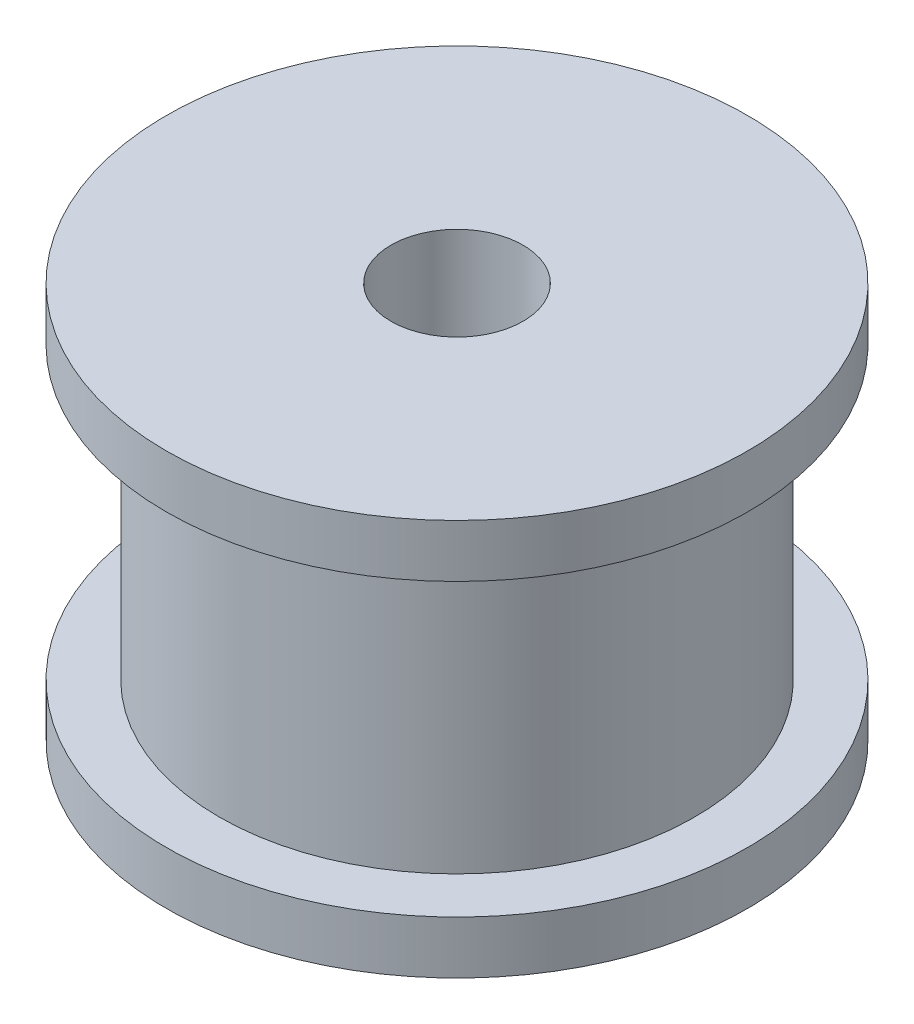
ISO-10303-21;
HEADER;
FILE_DESCRIPTION(('STEP AP214'),'2;1');
FILE_NAME('part.step','',(''),(''),'','','');
FILE_SCHEMA(('AUTOMOTIVE_DESIGN { 1 0 10303 214 1 1 1 1 }'));
ENDSEC;
DATA;
#1=APPLICATION_CONTEXT('core data for automotive mechanical design processes');
#2=APPLICATION_PROTOCOL_DEFINITION('international standard','automotive_design',2000,#1);
#3=PRODUCT_CONTEXT('',#1,'mechanical');
#4=PRODUCT('Part','Part','',(#3));
#5=PRODUCT_RELATED_PRODUCT_CATEGORY('part','',(#4));
#6=PRODUCT_DEFINITION_FORMATION('','',#4);
#7=PRODUCT_DEFINITION_CONTEXT('part definition',#1,'design');
#8=PRODUCT_DEFINITION('design','',#6,#7);
#9=PRODUCT_DEFINITION_SHAPE('','',#8);
#10=(LENGTH_UNIT() NAMED_UNIT(*) SI_UNIT(.MILLI.,.METRE.));
#11=(NAMED_UNIT(*) PLANE_ANGLE_UNIT() SI_UNIT($,.RADIAN.));
#12=(NAMED_UNIT(*) SI_UNIT($,.STERADIAN.) SOLID_ANGLE_UNIT());
#13=UNCERTAINTY_MEASURE_WITH_UNIT(LENGTH_MEASURE(1.E-05),#10,'distance_accuracy_value','');
#14=(GEOMETRIC_REPRESENTATION_CONTEXT(3) GLOBAL_UNCERTAINTY_ASSIGNED_CONTEXT((#13)) GLOBAL_UNIT_ASSIGNED_CONTEXT((#10,
#11,#12)) REPRESENTATION_CONTEXT('',''));
#15=CARTESIAN_POINT('',(0.,0.,0.));
#16=DIRECTION('',(0.,0.,1.));
#17=DIRECTION('',(1.,0.,0.));
#18=AXIS2_PLACEMENT_3D('',#15,#16,#17);
#19=CARTESIAN_POINT('',(0.,-11.,0.));
#20=DIRECTION('',(0.,1.,0.));
#21=DIRECTION('',(0.,0.,1.));
#22=AXIS2_PLACEMENT_3D('',#19,#20,#21);
#23=CYLINDRICAL_SURFACE('',#22,9.);
#24=CARTESIAN_POINT('',(0.,-11.,0.));
#25=DIRECTION('',(0.,1.,0.));
#26=DIRECTION('',(0.,0.,1.));
#27=AXIS2_PLACEMENT_3D('',#24,#25,#26);
#28=CIRCLE('',#27,9.);
#29=CARTESIAN_POINT('',(0.,-11.,9.));
#30=VERTEX_POINT('',#29);
#31=EDGE_CURVE('E52',#30,#30,#28,.T.);
#32=ORIENTED_EDGE('',*,*,#31,.T.);
#33=EDGE_LOOP('',(#32));
#34=FACE_BOUND('',#33,.T.);
#35=CARTESIAN_POINT('',(0.,0.,0.));
#36=DIRECTION('',(0.,1.,0.));
#37=DIRECTION('',(0.,0.,1.));
#38=AXIS2_PLACEMENT_3D('',#35,#36,#37);
#39=CIRCLE('',#38,9.);
#40=CARTESIAN_POINT('',(0.,0.,9.));
#41=VERTEX_POINT('',#40);
#42=EDGE_CURVE('E10',#41,#41,#39,.T.);
#43=ORIENTED_EDGE('',*,*,#42,.F.);
#44=EDGE_LOOP('',(#43));
#45=FACE_BOUND('',#44,.T.);
#46=ADVANCED_FACE('F38',(#34,#45),#23,.T.);
#47=CARTESIAN_POINT('',(0.,2.,0.));
#48=DIRECTION('',(0.,-1.,0.));
#49=DIRECTION('',(0.,0.,-1.));
#50=AXIS2_PLACEMENT_3D('',#47,#48,#49);
#51=CYLINDRICAL_SURFACE('',#50,11.);
#52=CARTESIAN_POINT('',(0.,2.,0.));
#53=DIRECTION('',(0.,1.,0.));
#54=DIRECTION('',(0.,0.,1.));
#55=AXIS2_PLACEMENT_3D('',#52,#53,#54);
#56=CIRCLE('',#55,11.);
#57=CARTESIAN_POINT('',(0.,2.,11.));
#58=VERTEX_POINT('',#57);
#59=EDGE_CURVE('E45',#58,#58,#56,.T.);
#60=ORIENTED_EDGE('',*,*,#59,.F.);
#61=EDGE_LOOP('',(#60));
#62=FACE_BOUND('',#61,.T.);
#63=CARTESIAN_POINT('',(0.,0.,0.));
#64=DIRECTION('',(0.,1.,0.));
#65=DIRECTION('',(0.,0.,1.));
#66=AXIS2_PLACEMENT_3D('',#63,#64,#65);
#67=CIRCLE('',#66,11.);
#68=CARTESIAN_POINT('',(0.,0.,11.));
#69=VERTEX_POINT('',#68);
#70=EDGE_CURVE('E49',#69,#69,#67,.T.);
#71=ORIENTED_EDGE('',*,*,#70,.T.);
#72=EDGE_LOOP('',(#71));
#73=FACE_BOUND('',#72,.T.);
#74=ADVANCED_FACE('F96',(#62,#73),#51,.T.);
#75=CARTESIAN_POINT('',(0.,2.,0.));
#76=DIRECTION('',(0.,1.,0.));
#77=DIRECTION('',(0.,0.,1.));
#78=AXIS2_PLACEMENT_3D('',#75,#76,#77);
#79=PLANE('',#78);
#80=CARTESIAN_POINT('',(0.,2.,0.));
#81=DIRECTION('',(0.,1.,0.));
#82=DIRECTION('',(0.,0.,1.));
#83=AXIS2_PLACEMENT_3D('',#80,#81,#82);
#84=CIRCLE('',#83,2.5);
#85=CARTESIAN_POINT('',(0.,2.,2.5));
#86=VERTEX_POINT('',#85);
#87=EDGE_CURVE('E63',#86,#86,#84,.T.);
#88=ORIENTED_EDGE('',*,*,#87,.F.);
#89=EDGE_LOOP('',(#88));
#90=FACE_BOUND('',#89,.T.);
#91=ORIENTED_EDGE('',*,*,#59,.T.);
#92=EDGE_LOOP('',(#91));
#93=FACE_BOUND('',#92,.T.);
#94=ADVANCED_FACE('F101',(#90,#93),#79,.T.);
#95=CARTESIAN_POINT('',(0.,0.,0.));
#96=DIRECTION('',(0.,1.,0.));
#97=DIRECTION('',(0.,0.,1.));
#98=AXIS2_PLACEMENT_3D('',#95,#96,#97);
#99=PLANE('',#98);
#100=ORIENTED_EDGE('',*,*,#42,.T.);
#101=EDGE_LOOP('',(#100));
#102=FACE_BOUND('',#101,.T.);
#103=ORIENTED_EDGE('',*,*,#70,.F.);
#104=EDGE_LOOP('',(#103));
#105=FACE_BOUND('',#104,.T.);
#106=ADVANCED_FACE('F82',(#102,#105),#99,.F.);
#107=CARTESIAN_POINT('',(0.,-13.,0.));
#108=DIRECTION('',(0.,1.,0.));
#109=DIRECTION('',(0.,0.,1.));
#110=AXIS2_PLACEMENT_3D('',#107,#108,#109);
#111=CYLINDRICAL_SURFACE('',#110,11.);
#112=CARTESIAN_POINT('',(0.,-13.,0.));
#113=DIRECTION('',(0.,-1.,0.));
#114=DIRECTION('',(0.,0.,-1.));
#115=AXIS2_PLACEMENT_3D('',#112,#113,#114);
#116=CIRCLE('',#115,11.);
#117=CARTESIAN_POINT('',(0.,-13.,-11.));
#118=VERTEX_POINT('',#117);
#119=EDGE_CURVE('E55',#118,#118,#116,.T.);
#120=ORIENTED_EDGE('',*,*,#119,.F.);
#121=EDGE_LOOP('',(#120));
#122=FACE_BOUND('',#121,.T.);
#123=CARTESIAN_POINT('',(0.,-11.,0.));
#124=DIRECTION('',(0.,-1.,0.));
#125=DIRECTION('',(0.,0.,-1.));
#126=AXIS2_PLACEMENT_3D('',#123,#124,#125);
#127=CIRCLE('',#126,11.);
#128=CARTESIAN_POINT('',(0.,-11.,-11.));
#129=VERTEX_POINT('',#128);
#130=EDGE_CURVE('E58',#129,#129,#127,.T.);
#131=ORIENTED_EDGE('',*,*,#130,.T.);
#132=EDGE_LOOP('',(#131));
#133=FACE_BOUND('',#132,.T.);
#134=ADVANCED_FACE('F76',(#122,#133),#111,.T.);
#135=CARTESIAN_POINT('',(0.,-13.,0.));
#136=DIRECTION('',(0.,-1.,0.));
#137=DIRECTION('',(0.,0.,-1.));
#138=AXIS2_PLACEMENT_3D('',#135,#136,#137);
#139=PLANE('',#138);
#140=CARTESIAN_POINT('',(0.,-13.,0.));
#141=DIRECTION('',(0.,-1.,0.));
#142=DIRECTION('',(0.,0.,-1.));
#143=AXIS2_PLACEMENT_3D('',#140,#141,#142);
#144=CIRCLE('',#143,2.5);
#145=CARTESIAN_POINT('',(0.,-13.,-2.5));
#146=VERTEX_POINT('',#145);
#147=EDGE_CURVE('E41',#146,#146,#144,.T.);
#148=ORIENTED_EDGE('',*,*,#147,.F.);
#149=EDGE_LOOP('',(#148));
#150=FACE_BOUND('',#149,.T.);
#151=ORIENTED_EDGE('',*,*,#119,.T.);
#152=EDGE_LOOP('',(#151));
#153=FACE_BOUND('',#152,.T.);
#154=ADVANCED_FACE('F72',(#150,#153),#139,.T.);
#155=CARTESIAN_POINT('',(0.,-11.,0.));
#156=DIRECTION('',(0.,-1.,0.));
#157=DIRECTION('',(0.,0.,-1.));
#158=AXIS2_PLACEMENT_3D('',#155,#156,#157);
#159=PLANE('',#158);
#160=ORIENTED_EDGE('',*,*,#31,.F.);
#161=EDGE_LOOP('',(#160));
#162=FACE_BOUND('',#161,.T.);
#163=ORIENTED_EDGE('',*,*,#130,.F.);
#164=EDGE_LOOP('',(#163));
#165=FACE_BOUND('',#164,.T.);
#166=ADVANCED_FACE('F75',(#162,#165),#159,.F.);
#167=CARTESIAN_POINT('',(0.,-20.,0.));
#168=DIRECTION('',(0.,1.,0.));
#169=DIRECTION('',(0.,0.,1.));
#170=AXIS2_PLACEMENT_3D('',#167,#168,#169);
#171=CYLINDRICAL_SURFACE('',#170,2.5);
#172=ORIENTED_EDGE('',*,*,#147,.T.);
#173=EDGE_LOOP('',(#172));
#174=FACE_BOUND('',#173,.T.);
#175=ORIENTED_EDGE('',*,*,#87,.T.);
#176=EDGE_LOOP('',(#175));
#177=FACE_BOUND('',#176,.T.);
#178=ADVANCED_FACE('F70',(#174,#177),#171,.F.);
#179=CLOSED_SHELL('',(#46,#74,#94,#106,#134,#154,#166,#178));
#180=MANIFOLD_SOLID_BREP('B2',#179);
#181=ADVANCED_BREP_SHAPE_REPRESENTATION('',(#18,#180),#14);
#182=SHAPE_DEFINITION_REPRESENTATION(#9,#181);
ENDSEC;
END-ISO-10303-21;
